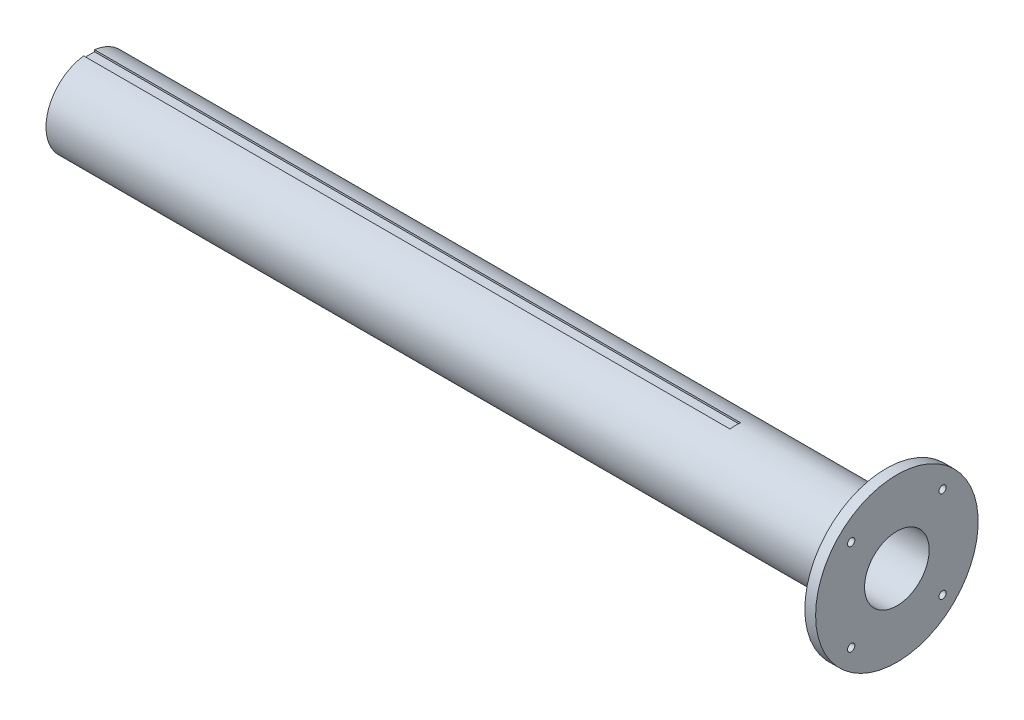
ISO-10303-21;
HEADER;
FILE_DESCRIPTION(('STEP AP214'),'2;1');
FILE_NAME('part.step','',(''),(''),'','','');
FILE_SCHEMA(('AUTOMOTIVE_DESIGN { 1 0 10303 214 1 1 1 1 }'));
ENDSEC;
DATA;
#1=APPLICATION_CONTEXT('core data for automotive mechanical design processes');
#2=APPLICATION_PROTOCOL_DEFINITION('international standard','automotive_design',2000,#1);
#3=PRODUCT_CONTEXT('',#1,'mechanical');
#4=PRODUCT('Part','Part','',(#3));
#5=PRODUCT_RELATED_PRODUCT_CATEGORY('part','',(#4));
#6=PRODUCT_DEFINITION_FORMATION('','',#4);
#7=PRODUCT_DEFINITION_CONTEXT('part definition',#1,'design');
#8=PRODUCT_DEFINITION('design','',#6,#7);
#9=PRODUCT_DEFINITION_SHAPE('','',#8);
#10=(LENGTH_UNIT() NAMED_UNIT(*) SI_UNIT(.MILLI.,.METRE.));
#11=(NAMED_UNIT(*) PLANE_ANGLE_UNIT() SI_UNIT($,.RADIAN.));
#12=(NAMED_UNIT(*) SI_UNIT($,.STERADIAN.) SOLID_ANGLE_UNIT());
#13=UNCERTAINTY_MEASURE_WITH_UNIT(LENGTH_MEASURE(1.E-05),#10,'distance_accuracy_value','');
#14=(GEOMETRIC_REPRESENTATION_CONTEXT(3) GLOBAL_UNCERTAINTY_ASSIGNED_CONTEXT((#13)) GLOBAL_UNIT_ASSIGNED_CONTEXT((#10,
#11,#12)) REPRESENTATION_CONTEXT('',''));
#15=CARTESIAN_POINT('',(0.,0.,0.));
#16=DIRECTION('',(0.,0.,1.));
#17=DIRECTION('',(1.,0.,0.));
#18=AXIS2_PLACEMENT_3D('',#15,#16,#17);
#19=CARTESIAN_POINT('',(-148.458149779736,40.,0.));
#20=DIRECTION('',(-1.,0.,0.));
#21=DIRECTION('',(0.,0.,1.));
#22=AXIS2_PLACEMENT_3D('',#19,#20,#21);
#23=CYLINDRICAL_SURFACE('',#22,40.);
#24=DIRECTION('',(-1.,0.,0.));
#25=VECTOR('',#24,1.);
#26=CARTESIAN_POINT('',(-148.458149779736,79.6862696659689,4.99999999999998));
#27=LINE('',#26,#25);
#28=CARTESIAN_POINT('',(-108.271234449894,79.6862696659689,4.99999999999998));
#29=VERTEX_POINT('',#28);
#30=CARTESIAN_POINT('',(491.728765550106,79.6862696659689,4.99999999999998));
#31=VERTEX_POINT('',#30);
#32=EDGE_CURVE('E64',#29,#31,#27,.F.);
#33=ORIENTED_EDGE('',*,*,#32,.F.);
#34=CARTESIAN_POINT('',(-108.271234449894,40.,0.));
#35=DIRECTION('',(-1.,0.,0.));
#36=DIRECTION('',(0.,0.,1.));
#37=AXIS2_PLACEMENT_3D('',#34,#35,#36);
#38=CIRCLE('',#37,40.);
#39=CARTESIAN_POINT('',(-108.271234449894,79.6862696659689,-5.00000000000002));
#40=VERTEX_POINT('',#39);
#41=EDGE_CURVE('E125',#40,#29,#38,.T.);
#42=ORIENTED_EDGE('',*,*,#41,.F.);
#43=DIRECTION('',(-1.,0.,0.));
#44=VECTOR('',#43,1.);
#45=CARTESIAN_POINT('',(-148.458149779736,79.6862696659689,-5.00000000000002));
#46=LINE('',#45,#44);
#47=CARTESIAN_POINT('',(491.728765550106,79.6862696659689,-5.00000000000002));
#48=VERTEX_POINT('',#47);
#49=EDGE_CURVE('E56',#48,#40,#46,.T.);
#50=ORIENTED_EDGE('',*,*,#49,.F.);
#51=CARTESIAN_POINT('',(491.728765550106,40.,0.));
#52=DIRECTION('',(-1.,0.,0.));
#53=DIRECTION('',(0.,0.,1.));
#54=AXIS2_PLACEMENT_3D('',#51,#52,#53);
#55=CIRCLE('',#54,40.);
#56=EDGE_CURVE('E11',#48,#31,#55,.F.);
#57=ORIENTED_EDGE('',*,*,#56,.T.);
#58=EDGE_LOOP('',(#33,#42,#50,#57));
#59=FACE_BOUND('',#58,.T.);
#60=CARTESIAN_POINT('',(631.728765550106,40.,0.));
#61=DIRECTION('',(-1.,0.,0.));
#62=DIRECTION('',(0.,0.,1.));
#63=AXIS2_PLACEMENT_3D('',#60,#61,#62);
#64=CIRCLE('',#63,40.);
#65=CARTESIAN_POINT('',(631.728765550106,40.,40.));
#66=VERTEX_POINT('',#65);
#67=EDGE_CURVE('E110',#66,#66,#64,.T.);
#68=ORIENTED_EDGE('',*,*,#67,.T.);
#69=EDGE_LOOP('',(#68));
#70=FACE_BOUND('',#69,.T.);
#71=ADVANCED_FACE('F41',(#59,#70),#23,.T.);
#72=CARTESIAN_POINT('',(-108.271234449894,10.,0.));
#73=DIRECTION('',(-1.,0.,0.));
#74=DIRECTION('',(0.,0.,1.));
#75=AXIS2_PLACEMENT_3D('',#72,#73,#74);
#76=PLANE('',#75);
#77=DIRECTION('',(0.,1.,0.));
#78=VECTOR('',#77,1.);
#79=CARTESIAN_POINT('',(-108.271234449894,82.,4.99999999999998));
#80=LINE('',#79,#78);
#81=CARTESIAN_POINT('',(-108.271234449894,78.,4.99999999999999));
#82=VERTEX_POINT('',#81);
#83=EDGE_CURVE('E102',#82,#29,#80,.T.);
#84=ORIENTED_EDGE('',*,*,#83,.F.);
#85=DIRECTION('',(0.,0.,1.));
#86=VECTOR('',#85,1.);
#87=CARTESIAN_POINT('',(-108.271234449894,78.,-5.00000000000002));
#88=LINE('',#87,#86);
#89=CARTESIAN_POINT('',(-108.271234449894,78.,-5.00000000000002));
#90=VERTEX_POINT('',#89);
#91=EDGE_CURVE('E104',#90,#82,#88,.T.);
#92=ORIENTED_EDGE('',*,*,#91,.F.);
#93=DIRECTION('',(0.,-1.,0.));
#94=VECTOR('',#93,1.);
#95=CARTESIAN_POINT('',(-108.271234449894,10.0000000000001,-5.00000000000003));
#96=LINE('',#95,#94);
#97=EDGE_CURVE('E49',#40,#90,#96,.T.);
#98=ORIENTED_EDGE('',*,*,#97,.F.);
#99=ORIENTED_EDGE('',*,*,#41,.T.);
#100=EDGE_LOOP('',(#84,#92,#98,#99));
#101=FACE_BOUND('',#100,.T.);
#102=CARTESIAN_POINT('',(-108.271234449894,40.,0.));
#103=DIRECTION('',(-1.,0.,0.));
#104=DIRECTION('',(0.,0.,1.));
#105=AXIS2_PLACEMENT_3D('',#102,#103,#104);
#106=CIRCLE('',#105,30.);
#107=CARTESIAN_POINT('',(-108.271234449894,40.,30.));
#108=VERTEX_POINT('',#107);
#109=EDGE_CURVE('E122',#108,#108,#106,.T.);
#110=ORIENTED_EDGE('',*,*,#109,.F.);
#111=EDGE_LOOP('',(#110));
#112=FACE_BOUND('',#111,.T.);
#113=ADVANCED_FACE('F131',(#101,#112),#76,.T.);
#114=CARTESIAN_POINT('',(-148.458149779736,40.,0.));
#115=DIRECTION('',(-1.,0.,0.));
#116=DIRECTION('',(0.,0.,1.));
#117=AXIS2_PLACEMENT_3D('',#114,#115,#116);
#118=CYLINDRICAL_SURFACE('',#117,30.);
#119=ORIENTED_EDGE('',*,*,#109,.T.);
#120=EDGE_LOOP('',(#119));
#121=FACE_BOUND('',#120,.T.);
#122=CARTESIAN_POINT('',(641.728765550106,40.,0.));
#123=DIRECTION('',(-1.,0.,0.));
#124=DIRECTION('',(0.,0.,1.));
#125=AXIS2_PLACEMENT_3D('',#122,#123,#124);
#126=CIRCLE('',#125,30.);
#127=CARTESIAN_POINT('',(641.728765550106,40.,30.));
#128=VERTEX_POINT('',#127);
#129=EDGE_CURVE('E119',#128,#128,#126,.T.);
#130=ORIENTED_EDGE('',*,*,#129,.F.);
#131=EDGE_LOOP('',(#130));
#132=FACE_BOUND('',#131,.T.);
#133=ADVANCED_FACE('F158',(#121,#132),#118,.F.);
#134=CARTESIAN_POINT('',(641.728765550106,-35.4625550660793,0.));
#135=DIRECTION('',(1.,0.,0.));
#136=DIRECTION('',(0.,0.,-1.));
#137=AXIS2_PLACEMENT_3D('',#134,#135,#136);
#138=PLANE('',#137);
#139=CARTESIAN_POINT('',(641.728765550106,82.4264068711929,42.4264068711929));
#140=DIRECTION('',(1.,0.,0.));
#141=DIRECTION('',(0.,0.,-1.));
#142=AXIS2_PLACEMENT_3D('',#139,#140,#141);
#143=CIRCLE('',#142,3.39999999999999);
#144=CARTESIAN_POINT('',(641.728765550106,82.4264068711929,39.0264068711929));
#145=VERTEX_POINT('',#144);
#146=EDGE_CURVE('E306',#145,#145,#143,.T.);
#147=ORIENTED_EDGE('',*,*,#146,.F.);
#148=EDGE_LOOP('',(#147));
#149=FACE_BOUND('',#148,.T.);
#150=CARTESIAN_POINT('',(641.728765550106,82.4264068711929,-42.4264068711928));
#151=DIRECTION('',(1.,0.,0.));
#152=DIRECTION('',(0.,0.,-1.));
#153=AXIS2_PLACEMENT_3D('',#150,#151,#152);
#154=CIRCLE('',#153,3.39999999999999);
#155=CARTESIAN_POINT('',(641.728765550106,82.4264068711929,-45.8264068711928));
#156=VERTEX_POINT('',#155);
#157=EDGE_CURVE('E308',#156,#156,#154,.T.);
#158=ORIENTED_EDGE('',*,*,#157,.F.);
#159=EDGE_LOOP('',(#158));
#160=FACE_BOUND('',#159,.T.);
#161=CARTESIAN_POINT('',(641.728765550106,-2.42640687119285,-42.4264068711928));
#162=DIRECTION('',(1.,0.,0.));
#163=DIRECTION('',(0.,0.,-1.));
#164=AXIS2_PLACEMENT_3D('',#161,#162,#163);
#165=CIRCLE('',#164,3.39999999999999);
#166=CARTESIAN_POINT('',(641.728765550106,-2.42640687119285,-45.8264068711928));
#167=VERTEX_POINT('',#166);
#168=EDGE_CURVE('E315',#167,#167,#165,.T.);
#169=ORIENTED_EDGE('',*,*,#168,.F.);
#170=EDGE_LOOP('',(#169));
#171=FACE_BOUND('',#170,.T.);
#172=CARTESIAN_POINT('',(641.728765550106,-2.42640687119286,42.4264068711929));
#173=DIRECTION('',(1.,0.,0.));
#174=DIRECTION('',(0.,0.,-1.));
#175=AXIS2_PLACEMENT_3D('',#172,#173,#174);
#176=CIRCLE('',#175,3.39999999999999);
#177=CARTESIAN_POINT('',(641.728765550106,-2.42640687119286,39.0264068711929));
#178=VERTEX_POINT('',#177);
#179=EDGE_CURVE('E321',#178,#178,#176,.T.);
#180=ORIENTED_EDGE('',*,*,#179,.F.);
#181=EDGE_LOOP('',(#180));
#182=FACE_BOUND('',#181,.T.);
#183=ORIENTED_EDGE('',*,*,#129,.T.);
#184=EDGE_LOOP('',(#183));
#185=FACE_BOUND('',#184,.T.);
#186=CARTESIAN_POINT('',(641.728765550106,40.,0.));
#187=DIRECTION('',(-1.,0.,0.));
#188=DIRECTION('',(0.,0.,1.));
#189=AXIS2_PLACEMENT_3D('',#186,#187,#188);
#190=CIRCLE('',#189,75.4625550660793);
#191=CARTESIAN_POINT('',(641.728765550106,40.,75.4625550660793));
#192=VERTEX_POINT('',#191);
#193=EDGE_CURVE('E116',#192,#192,#190,.T.);
#194=ORIENTED_EDGE('',*,*,#193,.F.);
#195=EDGE_LOOP('',(#194));
#196=FACE_BOUND('',#195,.T.);
#197=ADVANCED_FACE('F149',(#149,#160,#171,#182,#185,#196),#138,.T.);
#198=CARTESIAN_POINT('',(-148.458149779736,40.,0.));
#199=DIRECTION('',(-1.,0.,0.));
#200=DIRECTION('',(0.,0.,1.));
#201=AXIS2_PLACEMENT_3D('',#198,#199,#200);
#202=CYLINDRICAL_SURFACE('',#201,75.4625550660793);
#203=ORIENTED_EDGE('',*,*,#193,.T.);
#204=EDGE_LOOP('',(#203));
#205=FACE_BOUND('',#204,.T.);
#206=CARTESIAN_POINT('',(631.728765550106,40.,0.));
#207=DIRECTION('',(-1.,0.,0.));
#208=DIRECTION('',(0.,0.,1.));
#209=AXIS2_PLACEMENT_3D('',#206,#207,#208);
#210=CIRCLE('',#209,75.4625550660793);
#211=CARTESIAN_POINT('',(631.728765550106,40.,75.4625550660793));
#212=VERTEX_POINT('',#211);
#213=EDGE_CURVE('E113',#212,#212,#210,.T.);
#214=ORIENTED_EDGE('',*,*,#213,.F.);
#215=EDGE_LOOP('',(#214));
#216=FACE_BOUND('',#215,.T.);
#217=ADVANCED_FACE('F141',(#205,#216),#202,.T.);
#218=CARTESIAN_POINT('',(631.728765550106,0.,0.));
#219=DIRECTION('',(-1.,0.,0.));
#220=DIRECTION('',(0.,0.,1.));
#221=AXIS2_PLACEMENT_3D('',#218,#219,#220);
#222=PLANE('',#221);
#223=CARTESIAN_POINT('',(631.728765550106,82.4264068711929,42.4264068711929));
#224=DIRECTION('',(-1.,0.,0.));
#225=DIRECTION('',(0.,0.,1.));
#226=AXIS2_PLACEMENT_3D('',#223,#224,#225);
#227=CIRCLE('',#226,3.39999999999999);
#228=CARTESIAN_POINT('',(631.728765550106,82.4264068711929,45.8264068711928));
#229=VERTEX_POINT('',#228);
#230=EDGE_CURVE('E44',#229,#229,#227,.T.);
#231=ORIENTED_EDGE('',*,*,#230,.F.);
#232=EDGE_LOOP('',(#231));
#233=FACE_BOUND('',#232,.T.);
#234=CARTESIAN_POINT('',(631.728765550106,82.4264068711929,-42.4264068711928));
#235=DIRECTION('',(-1.,0.,0.));
#236=DIRECTION('',(0.,0.,1.));
#237=AXIS2_PLACEMENT_3D('',#234,#235,#236);
#238=CIRCLE('',#237,3.39999999999999);
#239=CARTESIAN_POINT('',(631.728765550106,82.4264068711929,-39.0264068711929));
#240=VERTEX_POINT('',#239);
#241=EDGE_CURVE('E312',#240,#240,#238,.T.);
#242=ORIENTED_EDGE('',*,*,#241,.F.);
#243=EDGE_LOOP('',(#242));
#244=FACE_BOUND('',#243,.T.);
#245=CARTESIAN_POINT('',(631.728765550106,-2.42640687119285,-42.4264068711928));
#246=DIRECTION('',(-1.,0.,0.));
#247=DIRECTION('',(0.,0.,1.));
#248=AXIS2_PLACEMENT_3D('',#245,#246,#247);
#249=CIRCLE('',#248,3.39999999999999);
#250=CARTESIAN_POINT('',(631.728765550106,-2.42640687119285,-39.0264068711929));
#251=VERTEX_POINT('',#250);
#252=EDGE_CURVE('E318',#251,#251,#249,.T.);
#253=ORIENTED_EDGE('',*,*,#252,.F.);
#254=EDGE_LOOP('',(#253));
#255=FACE_BOUND('',#254,.T.);
#256=CARTESIAN_POINT('',(631.728765550106,-2.42640687119286,42.4264068711929));
#257=DIRECTION('',(-1.,0.,0.));
#258=DIRECTION('',(0.,0.,1.));
#259=AXIS2_PLACEMENT_3D('',#256,#257,#258);
#260=CIRCLE('',#259,3.39999999999999);
#261=CARTESIAN_POINT('',(631.728765550106,-2.42640687119286,45.8264068711928));
#262=VERTEX_POINT('',#261);
#263=EDGE_CURVE('E105',#262,#262,#260,.T.);
#264=ORIENTED_EDGE('',*,*,#263,.F.);
#265=EDGE_LOOP('',(#264));
#266=FACE_BOUND('',#265,.T.);
#267=ORIENTED_EDGE('',*,*,#213,.T.);
#268=EDGE_LOOP('',(#267));
#269=FACE_BOUND('',#268,.T.);
#270=ORIENTED_EDGE('',*,*,#67,.F.);
#271=EDGE_LOOP('',(#270));
#272=FACE_BOUND('',#271,.T.);
#273=ADVANCED_FACE('F138',(#233,#244,#255,#266,#269,#272),#222,.T.);
#274=CARTESIAN_POINT('',(491.728765550106,82.,4.99999999999998));
#275=DIRECTION('',(0.,0.,1.));
#276=DIRECTION('',(0.,-1.,0.));
#277=AXIS2_PLACEMENT_3D('',#274,#275,#276);
#278=PLANE('',#277);
#279=ORIENTED_EDGE('',*,*,#32,.T.);
#280=DIRECTION('',(0.,1.,0.));
#281=VECTOR('',#280,1.);
#282=CARTESIAN_POINT('',(491.728765550106,82.,4.99999999999998));
#283=LINE('',#282,#281);
#284=CARTESIAN_POINT('',(491.728765550106,78.,4.99999999999999));
#285=VERTEX_POINT('',#284);
#286=EDGE_CURVE('E88',#285,#31,#283,.T.);
#287=ORIENTED_EDGE('',*,*,#286,.F.);
#288=DIRECTION('',(-1.,0.,0.));
#289=VECTOR('',#288,1.);
#290=CARTESIAN_POINT('',(491.728765550106,78.,4.99999999999999));
#291=LINE('',#290,#289);
#292=EDGE_CURVE('E96',#285,#82,#291,.T.);
#293=ORIENTED_EDGE('',*,*,#292,.T.);
#294=ORIENTED_EDGE('',*,*,#83,.T.);
#295=EDGE_LOOP('',(#279,#287,#293,#294));
#296=FACE_BOUND('',#295,.T.);
#297=ADVANCED_FACE('F140',(#296),#278,.F.);
#298=CARTESIAN_POINT('',(491.728765550106,78.,-5.00000000000002));
#299=DIRECTION('',(0.,-1.,0.));
#300=DIRECTION('',(0.,0.,-1.));
#301=AXIS2_PLACEMENT_3D('',#298,#299,#300);
#302=PLANE('',#301);
#303=ORIENTED_EDGE('',*,*,#91,.T.);
#304=ORIENTED_EDGE('',*,*,#292,.F.);
#305=DIRECTION('',(0.,0.,1.));
#306=VECTOR('',#305,1.);
#307=CARTESIAN_POINT('',(491.728765550106,78.,-5.00000000000002));
#308=LINE('',#307,#306);
#309=CARTESIAN_POINT('',(491.728765550106,78.,-5.00000000000002));
#310=VERTEX_POINT('',#309);
#311=EDGE_CURVE('E87',#310,#285,#308,.T.);
#312=ORIENTED_EDGE('',*,*,#311,.F.);
#313=DIRECTION('',(-1.,0.,0.));
#314=VECTOR('',#313,1.);
#315=CARTESIAN_POINT('',(491.728765550106,78.,-5.00000000000002));
#316=LINE('',#315,#314);
#317=EDGE_CURVE('E91',#310,#90,#316,.T.);
#318=ORIENTED_EDGE('',*,*,#317,.T.);
#319=EDGE_LOOP('',(#303,#304,#312,#318));
#320=FACE_BOUND('',#319,.T.);
#321=ADVANCED_FACE('F98',(#320),#302,.F.);
#322=CARTESIAN_POINT('',(491.728765550106,82.,-5.00000000000002));
#323=DIRECTION('',(0.,0.,-1.));
#324=DIRECTION('',(0.,1.,0.));
#325=AXIS2_PLACEMENT_3D('',#322,#323,#324);
#326=PLANE('',#325);
#327=ORIENTED_EDGE('',*,*,#49,.T.);
#328=ORIENTED_EDGE('',*,*,#97,.T.);
#329=ORIENTED_EDGE('',*,*,#317,.F.);
#330=DIRECTION('',(0.,-1.,0.));
#331=VECTOR('',#330,1.);
#332=CARTESIAN_POINT('',(491.728765550106,82.,-5.00000000000002));
#333=LINE('',#332,#331);
#334=EDGE_CURVE('E83',#48,#310,#333,.T.);
#335=ORIENTED_EDGE('',*,*,#334,.F.);
#336=EDGE_LOOP('',(#327,#328,#329,#335));
#337=FACE_BOUND('',#336,.T.);
#338=ADVANCED_FACE('F92',(#337),#326,.F.);
#339=CARTESIAN_POINT('',(491.728765550106,0.,0.));
#340=DIRECTION('',(-1.,0.,0.));
#341=DIRECTION('',(0.,0.,1.));
#342=AXIS2_PLACEMENT_3D('',#339,#340,#341);
#343=PLANE('',#342);
#344=ORIENTED_EDGE('',*,*,#334,.T.);
#345=ORIENTED_EDGE('',*,*,#311,.T.);
#346=ORIENTED_EDGE('',*,*,#286,.T.);
#347=ORIENTED_EDGE('',*,*,#56,.F.);
#348=EDGE_LOOP('',(#344,#345,#346,#347));
#349=FACE_BOUND('',#348,.T.);
#350=ADVANCED_FACE('F85',(#349),#343,.T.);
#351=CARTESIAN_POINT('',(641.728765550106,-2.42640687119286,42.4264068711929));
#352=DIRECTION('',(1.,0.,0.));
#353=DIRECTION('',(0.,0.,-1.));
#354=AXIS2_PLACEMENT_3D('',#351,#352,#353);
#355=CYLINDRICAL_SURFACE('',#354,3.39999999999999);
#356=ORIENTED_EDGE('',*,*,#263,.T.);
#357=EDGE_LOOP('',(#356));
#358=FACE_BOUND('',#357,.T.);
#359=ORIENTED_EDGE('',*,*,#179,.T.);
#360=EDGE_LOOP('',(#359));
#361=FACE_BOUND('',#360,.T.);
#362=ADVANCED_FACE('F235',(#358,#361),#355,.F.);
#363=CARTESIAN_POINT('',(641.728765550106,-2.42640687119285,-42.4264068711928));
#364=DIRECTION('',(1.,0.,0.));
#365=DIRECTION('',(0.,0.,-1.));
#366=AXIS2_PLACEMENT_3D('',#363,#364,#365);
#367=CYLINDRICAL_SURFACE('',#366,3.39999999999999);
#368=ORIENTED_EDGE('',*,*,#252,.T.);
#369=EDGE_LOOP('',(#368));
#370=FACE_BOUND('',#369,.T.);
#371=ORIENTED_EDGE('',*,*,#168,.T.);
#372=EDGE_LOOP('',(#371));
#373=FACE_BOUND('',#372,.T.);
#374=ADVANCED_FACE('F243',(#370,#373),#367,.F.);
#375=CARTESIAN_POINT('',(641.728765550106,82.4264068711929,-42.4264068711928));
#376=DIRECTION('',(1.,0.,0.));
#377=DIRECTION('',(0.,0.,-1.));
#378=AXIS2_PLACEMENT_3D('',#375,#376,#377);
#379=CYLINDRICAL_SURFACE('',#378,3.39999999999999);
#380=ORIENTED_EDGE('',*,*,#241,.T.);
#381=EDGE_LOOP('',(#380));
#382=FACE_BOUND('',#381,.T.);
#383=ORIENTED_EDGE('',*,*,#157,.T.);
#384=EDGE_LOOP('',(#383));
#385=FACE_BOUND('',#384,.T.);
#386=ADVANCED_FACE('F253',(#382,#385),#379,.F.);
#387=CARTESIAN_POINT('',(641.728765550106,82.4264068711929,42.4264068711929));
#388=DIRECTION('',(1.,0.,0.));
#389=DIRECTION('',(0.,0.,-1.));
#390=AXIS2_PLACEMENT_3D('',#387,#388,#389);
#391=CYLINDRICAL_SURFACE('',#390,3.39999999999999);
#392=ORIENTED_EDGE('',*,*,#230,.T.);
#393=EDGE_LOOP('',(#392));
#394=FACE_BOUND('',#393,.T.);
#395=ORIENTED_EDGE('',*,*,#146,.T.);
#396=EDGE_LOOP('',(#395));
#397=FACE_BOUND('',#396,.T.);
#398=ADVANCED_FACE('F263',(#394,#397),#391,.F.);
#399=CLOSED_SHELL('',(#71,#113,#133,#197,#217,#273,#297,#321,#338,#350,#362,#374,#386,#398));
#400=MANIFOLD_SOLID_BREP('B2',#399);
#401=ADVANCED_BREP_SHAPE_REPRESENTATION('',(#18,#400),#14);
#402=SHAPE_DEFINITION_REPRESENTATION(#9,#401);
ENDSEC;
END-ISO-10303-21;
